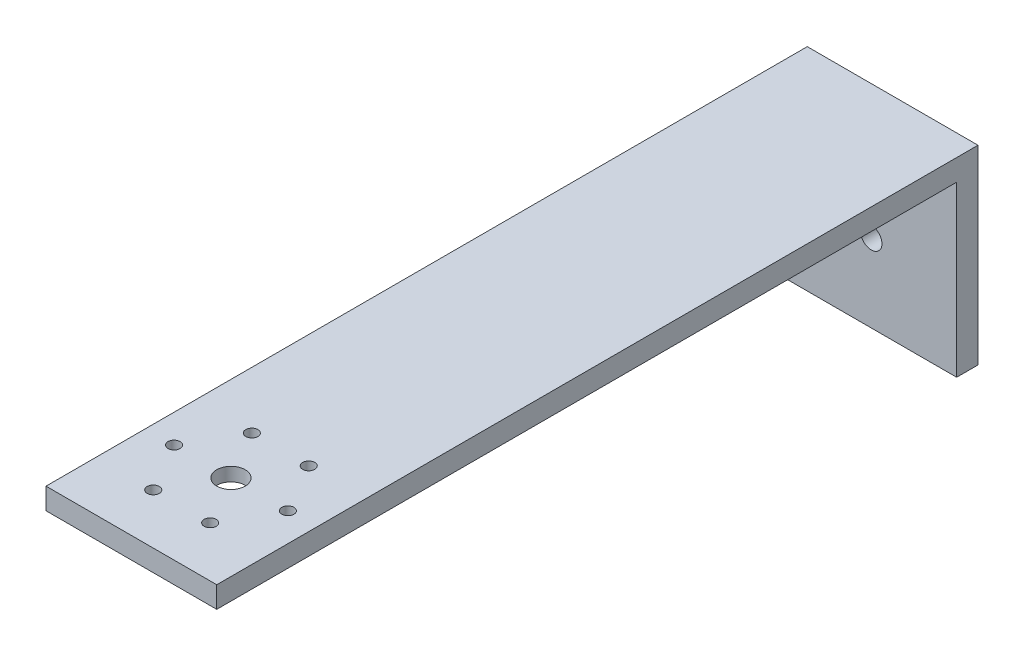
ISO-10303-21;
HEADER;
FILE_DESCRIPTION(('STEP AP214'),'2;1');
FILE_NAME('part.step','',(''),(''),'','','');
FILE_SCHEMA(('AUTOMOTIVE_DESIGN { 1 0 10303 214 1 1 1 1 }'));
ENDSEC;
DATA;
#1=APPLICATION_CONTEXT('core data for automotive mechanical design processes');
#2=APPLICATION_PROTOCOL_DEFINITION('international standard','automotive_design',2000,#1);
#3=PRODUCT_CONTEXT('',#1,'mechanical');
#4=PRODUCT('Part','Part','',(#3));
#5=PRODUCT_RELATED_PRODUCT_CATEGORY('part','',(#4));
#6=PRODUCT_DEFINITION_FORMATION('','',#4);
#7=PRODUCT_DEFINITION_CONTEXT('part definition',#1,'design');
#8=PRODUCT_DEFINITION('design','',#6,#7);
#9=PRODUCT_DEFINITION_SHAPE('','',#8);
#10=(LENGTH_UNIT() NAMED_UNIT(*) SI_UNIT(.MILLI.,.METRE.));
#11=(NAMED_UNIT(*) PLANE_ANGLE_UNIT() SI_UNIT($,.RADIAN.));
#12=(NAMED_UNIT(*) SI_UNIT($,.STERADIAN.) SOLID_ANGLE_UNIT());
#13=UNCERTAINTY_MEASURE_WITH_UNIT(LENGTH_MEASURE(1.E-05),#10,'distance_accuracy_value','');
#14=(GEOMETRIC_REPRESENTATION_CONTEXT(3) GLOBAL_UNCERTAINTY_ASSIGNED_CONTEXT((#13)) GLOBAL_UNIT_ASSIGNED_CONTEXT((#10,
#11,#12)) REPRESENTATION_CONTEXT('',''));
#15=CARTESIAN_POINT('',(0.,0.,0.));
#16=DIRECTION('',(0.,0.,1.));
#17=DIRECTION('',(1.,0.,0.));
#18=AXIS2_PLACEMENT_3D('',#15,#16,#17);
#19=CARTESIAN_POINT('',(0.,31.5,0.));
#20=DIRECTION('',(0.,1.,0.));
#21=DIRECTION('',(0.,0.,1.));
#22=AXIS2_PLACEMENT_3D('',#19,#20,#21);
#23=PLANE('',#22);
#24=CARTESIAN_POINT('',(8.,31.5,13.856406460551));
#25=DIRECTION('',(0.,1.,0.));
#26=DIRECTION('',(0.,0.,1.));
#27=AXIS2_PLACEMENT_3D('',#24,#25,#26);
#28=CIRCLE('',#27,1.7);
#29=CARTESIAN_POINT('',(8.,31.5,15.556406460551));
#30=VERTEX_POINT('',#29);
#31=EDGE_CURVE('E132',#30,#30,#28,.T.);
#32=ORIENTED_EDGE('',*,*,#31,.F.);
#33=EDGE_LOOP('',(#32));
#34=FACE_BOUND('',#33,.T.);
#35=CARTESIAN_POINT('',(-16.,31.5,0.));
#36=DIRECTION('',(0.,1.,0.));
#37=DIRECTION('',(0.,0.,1.));
#38=AXIS2_PLACEMENT_3D('',#35,#36,#37);
#39=CIRCLE('',#38,1.7);
#40=CARTESIAN_POINT('',(-16.,31.5,1.7));
#41=VERTEX_POINT('',#40);
#42=EDGE_CURVE('E150',#41,#41,#39,.T.);
#43=ORIENTED_EDGE('',*,*,#42,.F.);
#44=EDGE_LOOP('',(#43));
#45=FACE_BOUND('',#44,.T.);
#46=CARTESIAN_POINT('',(8.,31.5,-13.856406460551));
#47=DIRECTION('',(0.,1.,0.));
#48=DIRECTION('',(0.,0.,1.));
#49=AXIS2_PLACEMENT_3D('',#46,#47,#48);
#50=CIRCLE('',#49,1.7);
#51=CARTESIAN_POINT('',(8.,31.5,-12.156406460551));
#52=VERTEX_POINT('',#51);
#53=EDGE_CURVE('E157',#52,#52,#50,.T.);
#54=ORIENTED_EDGE('',*,*,#53,.F.);
#55=EDGE_LOOP('',(#54));
#56=FACE_BOUND('',#55,.T.);
#57=DIRECTION('',(0.,0.,1.));
#58=VECTOR('',#57,1.);
#59=CARTESIAN_POINT('',(-24.,31.5,-180.));
#60=LINE('',#59,#58);
#61=CARTESIAN_POINT('',(-24.,31.5,-186.));
#62=VERTEX_POINT('',#61);
#63=CARTESIAN_POINT('',(-24.,31.5,28.));
#64=VERTEX_POINT('',#63);
#65=EDGE_CURVE('E94',#62,#64,#60,.T.);
#66=ORIENTED_EDGE('',*,*,#65,.T.);
#67=DIRECTION('',(1.,0.,0.));
#68=VECTOR('',#67,1.);
#69=CARTESIAN_POINT('',(-24.,31.5,28.));
#70=LINE('',#69,#68);
#71=CARTESIAN_POINT('',(24.,31.5,28.));
#72=VERTEX_POINT('',#71);
#73=EDGE_CURVE('E60',#64,#72,#70,.T.);
#74=ORIENTED_EDGE('',*,*,#73,.T.);
#75=DIRECTION('',(0.,0.,-1.));
#76=VECTOR('',#75,1.);
#77=CARTESIAN_POINT('',(24.,31.5,28.));
#78=LINE('',#77,#76);
#79=CARTESIAN_POINT('',(24.,31.5,-186.));
#80=VERTEX_POINT('',#79);
#81=EDGE_CURVE('E171',#72,#80,#78,.T.);
#82=ORIENTED_EDGE('',*,*,#81,.T.);
#83=DIRECTION('',(-1.,0.,0.));
#84=VECTOR('',#83,1.);
#85=CARTESIAN_POINT('',(24.,31.5,-186.));
#86=LINE('',#85,#84);
#87=EDGE_CURVE('E117',#80,#62,#86,.T.);
#88=ORIENTED_EDGE('',*,*,#87,.T.);
#89=EDGE_LOOP('',(#66,#74,#82,#88));
#90=FACE_BOUND('',#89,.T.);
#91=CARTESIAN_POINT('',(16.,31.5,0.));
#92=DIRECTION('',(0.,1.,0.));
#93=DIRECTION('',(0.,0.,1.));
#94=AXIS2_PLACEMENT_3D('',#91,#92,#93);
#95=CIRCLE('',#94,1.7);
#96=CARTESIAN_POINT('',(16.,31.5,1.7));
#97=VERTEX_POINT('',#96);
#98=EDGE_CURVE('E164',#97,#97,#95,.T.);
#99=ORIENTED_EDGE('',*,*,#98,.F.);
#100=EDGE_LOOP('',(#99));
#101=FACE_BOUND('',#100,.T.);
#102=CARTESIAN_POINT('',(-8.,31.5,-13.856406460551));
#103=DIRECTION('',(0.,1.,0.));
#104=DIRECTION('',(0.,0.,1.));
#105=AXIS2_PLACEMENT_3D('',#102,#103,#104);
#106=CIRCLE('',#105,1.7);
#107=CARTESIAN_POINT('',(-8.,31.5,-12.156406460551));
#108=VERTEX_POINT('',#107);
#109=EDGE_CURVE('E153',#108,#108,#106,.T.);
#110=ORIENTED_EDGE('',*,*,#109,.F.);
#111=EDGE_LOOP('',(#110));
#112=FACE_BOUND('',#111,.T.);
#113=CARTESIAN_POINT('',(-8.00000000000001,31.5,13.856406460551));
#114=DIRECTION('',(0.,1.,0.));
#115=DIRECTION('',(0.,0.,1.));
#116=AXIS2_PLACEMENT_3D('',#113,#114,#115);
#117=CIRCLE('',#116,1.7);
#118=CARTESIAN_POINT('',(-8.00000000000001,31.5,15.556406460551));
#119=VERTEX_POINT('',#118);
#120=EDGE_CURVE('E143',#119,#119,#117,.T.);
#121=ORIENTED_EDGE('',*,*,#120,.F.);
#122=EDGE_LOOP('',(#121));
#123=FACE_BOUND('',#122,.T.);
#124=CARTESIAN_POINT('',(0.,31.5,0.));
#125=DIRECTION('',(0.,1.,0.));
#126=DIRECTION('',(0.,0.,1.));
#127=AXIS2_PLACEMENT_3D('',#124,#125,#126);
#128=CIRCLE('',#127,4.);
#129=CARTESIAN_POINT('',(0.,31.5,4.));
#130=VERTEX_POINT('',#129);
#131=EDGE_CURVE('E134',#130,#130,#128,.T.);
#132=ORIENTED_EDGE('',*,*,#131,.F.);
#133=EDGE_LOOP('',(#132));
#134=FACE_BOUND('',#133,.T.);
#135=ADVANCED_FACE('F39',(#34,#45,#56,#90,#101,#112,#123,#134),#23,.T.);
#136=CARTESIAN_POINT('',(0.,25.5,0.));
#137=DIRECTION('',(0.,1.,0.));
#138=DIRECTION('',(0.,0.,1.));
#139=AXIS2_PLACEMENT_3D('',#136,#137,#138);
#140=PLANE('',#139);
#141=CARTESIAN_POINT('',(0.,25.5,0.));
#142=DIRECTION('',(0.,1.,0.));
#143=DIRECTION('',(0.,0.,1.));
#144=AXIS2_PLACEMENT_3D('',#141,#142,#143);
#145=CIRCLE('',#144,12.15);
#146=CARTESIAN_POINT('',(0.,25.5,12.15));
#147=VERTEX_POINT('',#146);
#148=EDGE_CURVE('E123',#147,#147,#145,.T.);
#149=ORIENTED_EDGE('',*,*,#148,.T.);
#150=EDGE_LOOP('',(#149));
#151=FACE_BOUND('',#150,.T.);
#152=DIRECTION('',(0.,0.,1.));
#153=VECTOR('',#152,1.);
#154=CARTESIAN_POINT('',(-24.,25.5,-180.));
#155=LINE('',#154,#153);
#156=CARTESIAN_POINT('',(-24.,25.5,-180.));
#157=VERTEX_POINT('',#156);
#158=CARTESIAN_POINT('',(-24.,25.5,28.));
#159=VERTEX_POINT('',#158);
#160=EDGE_CURVE('E89',#157,#159,#155,.T.);
#161=ORIENTED_EDGE('',*,*,#160,.F.);
#162=DIRECTION('',(-1.,0.,0.));
#163=VECTOR('',#162,1.);
#164=CARTESIAN_POINT('',(24.,25.5,-180.));
#165=LINE('',#164,#163);
#166=CARTESIAN_POINT('',(24.,25.5,-180.));
#167=VERTEX_POINT('',#166);
#168=EDGE_CURVE('E84',#167,#157,#165,.T.);
#169=ORIENTED_EDGE('',*,*,#168,.F.);
#170=DIRECTION('',(0.,0.,-1.));
#171=VECTOR('',#170,1.);
#172=CARTESIAN_POINT('',(24.,25.5,28.));
#173=LINE('',#172,#171);
#174=CARTESIAN_POINT('',(24.,25.5,28.));
#175=VERTEX_POINT('',#174);
#176=EDGE_CURVE('E74',#175,#167,#173,.T.);
#177=ORIENTED_EDGE('',*,*,#176,.F.);
#178=DIRECTION('',(1.,0.,0.));
#179=VECTOR('',#178,1.);
#180=CARTESIAN_POINT('',(-24.,25.5,28.));
#181=LINE('',#180,#179);
#182=EDGE_CURVE('E69',#159,#175,#181,.T.);
#183=ORIENTED_EDGE('',*,*,#182,.F.);
#184=EDGE_LOOP('',(#161,#169,#177,#183));
#185=FACE_BOUND('',#184,.T.);
#186=CARTESIAN_POINT('',(16.,25.5,0.));
#187=DIRECTION('',(0.,1.,0.));
#188=DIRECTION('',(0.,0.,1.));
#189=AXIS2_PLACEMENT_3D('',#186,#187,#188);
#190=CIRCLE('',#189,1.7);
#191=CARTESIAN_POINT('',(16.,25.5,1.7));
#192=VERTEX_POINT('',#191);
#193=EDGE_CURVE('E165',#192,#192,#190,.T.);
#194=ORIENTED_EDGE('',*,*,#193,.T.);
#195=EDGE_LOOP('',(#194));
#196=FACE_BOUND('',#195,.T.);
#197=CARTESIAN_POINT('',(8.,25.5,-13.856406460551));
#198=DIRECTION('',(0.,1.,0.));
#199=DIRECTION('',(0.,0.,1.));
#200=AXIS2_PLACEMENT_3D('',#197,#198,#199);
#201=CIRCLE('',#200,1.7);
#202=CARTESIAN_POINT('',(8.,25.5,-12.156406460551));
#203=VERTEX_POINT('',#202);
#204=EDGE_CURVE('E156',#203,#203,#201,.T.);
#205=ORIENTED_EDGE('',*,*,#204,.T.);
#206=EDGE_LOOP('',(#205));
#207=FACE_BOUND('',#206,.T.);
#208=CARTESIAN_POINT('',(-8.,25.5,-13.856406460551));
#209=DIRECTION('',(0.,1.,0.));
#210=DIRECTION('',(0.,0.,1.));
#211=AXIS2_PLACEMENT_3D('',#208,#209,#210);
#212=CIRCLE('',#211,1.7);
#213=CARTESIAN_POINT('',(-8.,25.5,-12.156406460551));
#214=VERTEX_POINT('',#213);
#215=EDGE_CURVE('E147',#214,#214,#212,.T.);
#216=ORIENTED_EDGE('',*,*,#215,.T.);
#217=EDGE_LOOP('',(#216));
#218=FACE_BOUND('',#217,.T.);
#219=CARTESIAN_POINT('',(-16.,25.5,0.));
#220=DIRECTION('',(0.,1.,0.));
#221=DIRECTION('',(0.,0.,1.));
#222=AXIS2_PLACEMENT_3D('',#219,#220,#221);
#223=CIRCLE('',#222,1.7);
#224=CARTESIAN_POINT('',(-16.,25.5,1.7));
#225=VERTEX_POINT('',#224);
#226=EDGE_CURVE('E145',#225,#225,#223,.T.);
#227=ORIENTED_EDGE('',*,*,#226,.T.);
#228=EDGE_LOOP('',(#227));
#229=FACE_BOUND('',#228,.T.);
#230=CARTESIAN_POINT('',(-8.00000000000001,25.5,13.856406460551));
#231=DIRECTION('',(0.,1.,0.));
#232=DIRECTION('',(0.,0.,1.));
#233=AXIS2_PLACEMENT_3D('',#230,#231,#232);
#234=CIRCLE('',#233,1.7);
#235=CARTESIAN_POINT('',(-8.00000000000001,25.5,15.556406460551));
#236=VERTEX_POINT('',#235);
#237=EDGE_CURVE('E139',#236,#236,#234,.T.);
#238=ORIENTED_EDGE('',*,*,#237,.T.);
#239=EDGE_LOOP('',(#238));
#240=FACE_BOUND('',#239,.T.);
#241=CARTESIAN_POINT('',(8.,25.5,13.856406460551));
#242=DIRECTION('',(0.,1.,0.));
#243=DIRECTION('',(0.,0.,1.));
#244=AXIS2_PLACEMENT_3D('',#241,#242,#243);
#245=CIRCLE('',#244,1.7);
#246=CARTESIAN_POINT('',(8.,25.5,15.556406460551));
#247=VERTEX_POINT('',#246);
#248=EDGE_CURVE('E133',#247,#247,#245,.T.);
#249=ORIENTED_EDGE('',*,*,#248,.T.);
#250=EDGE_LOOP('',(#249));
#251=FACE_BOUND('',#250,.T.);
#252=ADVANCED_FACE('F87',(#151,#185,#196,#207,#218,#229,#240,#251),#140,.F.);
#253=CARTESIAN_POINT('',(-24.,31.5,-180.));
#254=DIRECTION('',(1.,0.,0.));
#255=DIRECTION('',(0.,0.,-1.));
#256=AXIS2_PLACEMENT_3D('',#253,#254,#255);
#257=PLANE('',#256);
#258=ORIENTED_EDGE('',*,*,#160,.T.);
#259=DIRECTION('',(0.,-1.,0.));
#260=VECTOR('',#259,1.);
#261=CARTESIAN_POINT('',(-24.,31.5,28.));
#262=LINE('',#261,#260);
#263=EDGE_CURVE('E11',#64,#159,#262,.T.);
#264=ORIENTED_EDGE('',*,*,#263,.F.);
#265=ORIENTED_EDGE('',*,*,#65,.F.);
#266=DIRECTION('',(0.,-1.,0.));
#267=VECTOR('',#266,1.);
#268=CARTESIAN_POINT('',(-24.,31.5,-186.));
#269=LINE('',#268,#267);
#270=CARTESIAN_POINT('',(-24.,-22.,-186.));
#271=VERTEX_POINT('',#270);
#272=EDGE_CURVE('E109',#62,#271,#269,.T.);
#273=ORIENTED_EDGE('',*,*,#272,.T.);
#274=DIRECTION('',(0.,0.,-1.));
#275=VECTOR('',#274,1.);
#276=CARTESIAN_POINT('',(-24.,-22.,-180.));
#277=LINE('',#276,#275);
#278=CARTESIAN_POINT('',(-24.,-22.,-180.));
#279=VERTEX_POINT('',#278);
#280=EDGE_CURVE('E102',#279,#271,#277,.T.);
#281=ORIENTED_EDGE('',*,*,#280,.F.);
#282=DIRECTION('',(0.,-1.,0.));
#283=VECTOR('',#282,1.);
#284=CARTESIAN_POINT('',(-24.,31.5,-180.));
#285=LINE('',#284,#283);
#286=EDGE_CURVE('E106',#157,#279,#285,.T.);
#287=ORIENTED_EDGE('',*,*,#286,.F.);
#288=EDGE_LOOP('',(#258,#264,#265,#273,#281,#287));
#289=FACE_BOUND('',#288,.T.);
#290=ADVANCED_FACE('F41',(#289),#257,.F.);
#291=CARTESIAN_POINT('',(-24.,31.5,28.));
#292=DIRECTION('',(0.,0.,-1.));
#293=DIRECTION('',(-1.,0.,0.));
#294=AXIS2_PLACEMENT_3D('',#291,#292,#293);
#295=PLANE('',#294);
#296=ORIENTED_EDGE('',*,*,#182,.T.);
#297=DIRECTION('',(0.,-1.,0.));
#298=VECTOR('',#297,1.);
#299=CARTESIAN_POINT('',(24.,31.5,28.));
#300=LINE('',#299,#298);
#301=EDGE_CURVE('E47',#72,#175,#300,.T.);
#302=ORIENTED_EDGE('',*,*,#301,.F.);
#303=ORIENTED_EDGE('',*,*,#73,.F.);
#304=ORIENTED_EDGE('',*,*,#263,.T.);
#305=EDGE_LOOP('',(#296,#302,#303,#304));
#306=FACE_BOUND('',#305,.T.);
#307=ADVANCED_FACE('F219',(#306),#295,.F.);
#308=CARTESIAN_POINT('',(24.,31.5,28.));
#309=DIRECTION('',(-1.,0.,0.));
#310=DIRECTION('',(0.,0.,1.));
#311=AXIS2_PLACEMENT_3D('',#308,#309,#310);
#312=PLANE('',#311);
#313=ORIENTED_EDGE('',*,*,#176,.T.);
#314=DIRECTION('',(0.,1.,0.));
#315=VECTOR('',#314,1.);
#316=CARTESIAN_POINT('',(24.,-22.,-180.));
#317=LINE('',#316,#315);
#318=CARTESIAN_POINT('',(24.,-22.,-180.));
#319=VERTEX_POINT('',#318);
#320=EDGE_CURVE('E77',#319,#167,#317,.T.);
#321=ORIENTED_EDGE('',*,*,#320,.F.);
#322=DIRECTION('',(0.,0.,-1.));
#323=VECTOR('',#322,1.);
#324=CARTESIAN_POINT('',(24.,-22.,-180.));
#325=LINE('',#324,#323);
#326=CARTESIAN_POINT('',(24.,-22.,-186.));
#327=VERTEX_POINT('',#326);
#328=EDGE_CURVE('E105',#319,#327,#325,.T.);
#329=ORIENTED_EDGE('',*,*,#328,.T.);
#330=DIRECTION('',(0.,1.,0.));
#331=VECTOR('',#330,1.);
#332=CARTESIAN_POINT('',(24.,-22.,-186.));
#333=LINE('',#332,#331);
#334=EDGE_CURVE('E116',#327,#80,#333,.T.);
#335=ORIENTED_EDGE('',*,*,#334,.T.);
#336=ORIENTED_EDGE('',*,*,#81,.F.);
#337=ORIENTED_EDGE('',*,*,#301,.T.);
#338=EDGE_LOOP('',(#313,#321,#329,#335,#336,#337));
#339=FACE_BOUND('',#338,.T.);
#340=ADVANCED_FACE('F79',(#339),#312,.F.);
#341=CARTESIAN_POINT('',(16.,31.5,0.));
#342=DIRECTION('',(0.,-1.,0.));
#343=DIRECTION('',(0.,0.,-1.));
#344=AXIS2_PLACEMENT_3D('',#341,#342,#343);
#345=CYLINDRICAL_SURFACE('',#344,1.7);
#346=ORIENTED_EDGE('',*,*,#98,.T.);
#347=EDGE_LOOP('',(#346));
#348=FACE_BOUND('',#347,.T.);
#349=ORIENTED_EDGE('',*,*,#193,.F.);
#350=EDGE_LOOP('',(#349));
#351=FACE_BOUND('',#350,.T.);
#352=ADVANCED_FACE('F220',(#348,#351),#345,.F.);
#353=CARTESIAN_POINT('',(8.,31.5,-13.856406460551));
#354=DIRECTION('',(0.,-1.,0.));
#355=DIRECTION('',(0.,0.,-1.));
#356=AXIS2_PLACEMENT_3D('',#353,#354,#355);
#357=CYLINDRICAL_SURFACE('',#356,1.7);
#358=ORIENTED_EDGE('',*,*,#53,.T.);
#359=EDGE_LOOP('',(#358));
#360=FACE_BOUND('',#359,.T.);
#361=ORIENTED_EDGE('',*,*,#204,.F.);
#362=EDGE_LOOP('',(#361));
#363=FACE_BOUND('',#362,.T.);
#364=ADVANCED_FACE('F292',(#360,#363),#357,.F.);
#365=CARTESIAN_POINT('',(-8.,31.5,-13.856406460551));
#366=DIRECTION('',(0.,-1.,0.));
#367=DIRECTION('',(0.,0.,-1.));
#368=AXIS2_PLACEMENT_3D('',#365,#366,#367);
#369=CYLINDRICAL_SURFACE('',#368,1.7);
#370=ORIENTED_EDGE('',*,*,#109,.T.);
#371=EDGE_LOOP('',(#370));
#372=FACE_BOUND('',#371,.T.);
#373=ORIENTED_EDGE('',*,*,#215,.F.);
#374=EDGE_LOOP('',(#373));
#375=FACE_BOUND('',#374,.T.);
#376=ADVANCED_FACE('F289',(#372,#375),#369,.F.);
#377=CARTESIAN_POINT('',(-16.,31.5,0.));
#378=DIRECTION('',(0.,-1.,0.));
#379=DIRECTION('',(0.,0.,-1.));
#380=AXIS2_PLACEMENT_3D('',#377,#378,#379);
#381=CYLINDRICAL_SURFACE('',#380,1.7);
#382=ORIENTED_EDGE('',*,*,#42,.T.);
#383=EDGE_LOOP('',(#382));
#384=FACE_BOUND('',#383,.T.);
#385=ORIENTED_EDGE('',*,*,#226,.F.);
#386=EDGE_LOOP('',(#385));
#387=FACE_BOUND('',#386,.T.);
#388=ADVANCED_FACE('F283',(#384,#387),#381,.F.);
#389=CARTESIAN_POINT('',(-8.00000000000001,31.5,13.856406460551));
#390=DIRECTION('',(0.,-1.,0.));
#391=DIRECTION('',(0.,0.,-1.));
#392=AXIS2_PLACEMENT_3D('',#389,#390,#391);
#393=CYLINDRICAL_SURFACE('',#392,1.7);
#394=ORIENTED_EDGE('',*,*,#120,.T.);
#395=EDGE_LOOP('',(#394));
#396=FACE_BOUND('',#395,.T.);
#397=ORIENTED_EDGE('',*,*,#237,.F.);
#398=EDGE_LOOP('',(#397));
#399=FACE_BOUND('',#398,.T.);
#400=ADVANCED_FACE('F278',(#396,#399),#393,.F.);
#401=CARTESIAN_POINT('',(8.,31.5,13.856406460551));
#402=DIRECTION('',(0.,-1.,0.));
#403=DIRECTION('',(0.,0.,-1.));
#404=AXIS2_PLACEMENT_3D('',#401,#402,#403);
#405=CYLINDRICAL_SURFACE('',#404,1.7);
#406=ORIENTED_EDGE('',*,*,#31,.T.);
#407=EDGE_LOOP('',(#406));
#408=FACE_BOUND('',#407,.T.);
#409=ORIENTED_EDGE('',*,*,#248,.F.);
#410=EDGE_LOOP('',(#409));
#411=FACE_BOUND('',#410,.T.);
#412=ADVANCED_FACE('F277',(#408,#411),#405,.F.);
#413=CARTESIAN_POINT('',(0.,31.5,0.));
#414=DIRECTION('',(0.,-1.,0.));
#415=DIRECTION('',(0.,0.,-1.));
#416=AXIS2_PLACEMENT_3D('',#413,#414,#415);
#417=CYLINDRICAL_SURFACE('',#416,4.);
#418=CARTESIAN_POINT('',(0.,27.7,0.));
#419=DIRECTION('',(0.,1.,0.));
#420=DIRECTION('',(0.,0.,1.));
#421=AXIS2_PLACEMENT_3D('',#418,#419,#420);
#422=CIRCLE('',#421,4.);
#423=CARTESIAN_POINT('',(0.,27.7,4.));
#424=VERTEX_POINT('',#423);
#425=EDGE_CURVE('E43',#424,#424,#422,.T.);
#426=ORIENTED_EDGE('',*,*,#425,.F.);
#427=EDGE_LOOP('',(#426));
#428=FACE_BOUND('',#427,.T.);
#429=ORIENTED_EDGE('',*,*,#131,.T.);
#430=EDGE_LOOP('',(#429));
#431=FACE_BOUND('',#430,.T.);
#432=ADVANCED_FACE('F275',(#428,#431),#417,.F.);
#433=CARTESIAN_POINT('',(0.,27.7,0.));
#434=DIRECTION('',(0.,-1.,0.));
#435=DIRECTION('',(0.,0.,-1.));
#436=AXIS2_PLACEMENT_3D('',#433,#434,#435);
#437=CYLINDRICAL_SURFACE('',#436,12.15);
#438=CARTESIAN_POINT('',(0.,27.7,0.));
#439=DIRECTION('',(0.,1.,0.));
#440=DIRECTION('',(0.,0.,1.));
#441=AXIS2_PLACEMENT_3D('',#438,#439,#440);
#442=CIRCLE('',#441,12.15);
#443=CARTESIAN_POINT('',(0.,27.7,12.15));
#444=VERTEX_POINT('',#443);
#445=EDGE_CURVE('E127',#444,#444,#442,.T.);
#446=ORIENTED_EDGE('',*,*,#445,.T.);
#447=EDGE_LOOP('',(#446));
#448=FACE_BOUND('',#447,.T.);
#449=ORIENTED_EDGE('',*,*,#148,.F.);
#450=EDGE_LOOP('',(#449));
#451=FACE_BOUND('',#450,.T.);
#452=ADVANCED_FACE('F205',(#448,#451),#437,.F.);
#453=CARTESIAN_POINT('',(0.,27.7,0.));
#454=DIRECTION('',(0.,1.,0.));
#455=DIRECTION('',(0.,0.,1.));
#456=AXIS2_PLACEMENT_3D('',#453,#454,#455);
#457=PLANE('',#456);
#458=ORIENTED_EDGE('',*,*,#425,.T.);
#459=EDGE_LOOP('',(#458));
#460=FACE_BOUND('',#459,.T.);
#461=ORIENTED_EDGE('',*,*,#445,.F.);
#462=EDGE_LOOP('',(#461));
#463=FACE_BOUND('',#462,.T.);
#464=ADVANCED_FACE('F195',(#460,#463),#457,.F.);
#465=CARTESIAN_POINT('',(0.,0.,-180.));
#466=DIRECTION('',(0.,0.,1.));
#467=DIRECTION('',(1.,0.,0.));
#468=AXIS2_PLACEMENT_3D('',#465,#466,#467);
#469=PLANE('',#468);
#470=ORIENTED_EDGE('',*,*,#320,.T.);
#471=ORIENTED_EDGE('',*,*,#168,.T.);
#472=ORIENTED_EDGE('',*,*,#286,.T.);
#473=DIRECTION('',(1.,0.,0.));
#474=VECTOR('',#473,1.);
#475=CARTESIAN_POINT('',(-24.,-22.,-180.));
#476=LINE('',#475,#474);
#477=EDGE_CURVE('E99',#279,#319,#476,.T.);
#478=ORIENTED_EDGE('',*,*,#477,.T.);
#479=EDGE_LOOP('',(#470,#471,#472,#478));
#480=FACE_BOUND('',#479,.T.);
#481=CARTESIAN_POINT('',(0.,0.,-180.));
#482=DIRECTION('',(0.,0.,1.));
#483=DIRECTION('',(1.,0.,0.));
#484=AXIS2_PLACEMENT_3D('',#481,#482,#483);
#485=CIRCLE('',#484,3.);
#486=CARTESIAN_POINT('',(3.,0.,-180.));
#487=VERTEX_POINT('',#486);
#488=EDGE_CURVE('E111',#487,#487,#485,.T.);
#489=ORIENTED_EDGE('',*,*,#488,.F.);
#490=EDGE_LOOP('',(#489));
#491=FACE_BOUND('',#490,.T.);
#492=ADVANCED_FACE('F100',(#480,#491),#469,.T.);
#493=CARTESIAN_POINT('',(0.,0.,-186.));
#494=DIRECTION('',(0.,0.,1.));
#495=DIRECTION('',(1.,0.,0.));
#496=AXIS2_PLACEMENT_3D('',#493,#494,#495);
#497=PLANE('',#496);
#498=ORIENTED_EDGE('',*,*,#272,.F.);
#499=ORIENTED_EDGE('',*,*,#87,.F.);
#500=ORIENTED_EDGE('',*,*,#334,.F.);
#501=DIRECTION('',(1.,0.,0.));
#502=VECTOR('',#501,1.);
#503=CARTESIAN_POINT('',(-24.,-22.,-186.));
#504=LINE('',#503,#502);
#505=EDGE_CURVE('E114',#271,#327,#504,.T.);
#506=ORIENTED_EDGE('',*,*,#505,.F.);
#507=EDGE_LOOP('',(#498,#499,#500,#506));
#508=FACE_BOUND('',#507,.T.);
#509=CARTESIAN_POINT('',(0.,0.,-186.));
#510=DIRECTION('',(0.,0.,1.));
#511=DIRECTION('',(1.,0.,0.));
#512=AXIS2_PLACEMENT_3D('',#509,#510,#511);
#513=CIRCLE('',#512,3.);
#514=CARTESIAN_POINT('',(3.,0.,-186.));
#515=VERTEX_POINT('',#514);
#516=EDGE_CURVE('E185',#515,#515,#513,.T.);
#517=ORIENTED_EDGE('',*,*,#516,.T.);
#518=EDGE_LOOP('',(#517));
#519=FACE_BOUND('',#518,.T.);
#520=ADVANCED_FACE('F192',(#508,#519),#497,.F.);
#521=CARTESIAN_POINT('',(-24.,-22.,-180.));
#522=DIRECTION('',(0.,1.,0.));
#523=DIRECTION('',(0.,0.,1.));
#524=AXIS2_PLACEMENT_3D('',#521,#522,#523);
#525=PLANE('',#524);
#526=ORIENTED_EDGE('',*,*,#505,.T.);
#527=ORIENTED_EDGE('',*,*,#328,.F.);
#528=ORIENTED_EDGE('',*,*,#477,.F.);
#529=ORIENTED_EDGE('',*,*,#280,.T.);
#530=EDGE_LOOP('',(#526,#527,#528,#529));
#531=FACE_BOUND('',#530,.T.);
#532=ADVANCED_FACE('F196',(#531),#525,.F.);
#533=CARTESIAN_POINT('',(0.,0.,-180.));
#534=DIRECTION('',(0.,0.,-1.));
#535=DIRECTION('',(-1.,0.,0.));
#536=AXIS2_PLACEMENT_3D('',#533,#534,#535);
#537=CYLINDRICAL_SURFACE('',#536,3.);
#538=ORIENTED_EDGE('',*,*,#488,.T.);
#539=EDGE_LOOP('',(#538));
#540=FACE_BOUND('',#539,.T.);
#541=ORIENTED_EDGE('',*,*,#516,.F.);
#542=EDGE_LOOP('',(#541));
#543=FACE_BOUND('',#542,.T.);
#544=ADVANCED_FACE('F190',(#540,#543),#537,.F.);
#545=CLOSED_SHELL('',(#135,#252,#290,#307,#340,#352,#364,#376,#388,#400,#412,#432,#452,#464,
#492,#520,#532,#544));
#546=MANIFOLD_SOLID_BREP('B2',#545);
#547=ADVANCED_BREP_SHAPE_REPRESENTATION('',(#18,#546),#14);
#548=SHAPE_DEFINITION_REPRESENTATION(#9,#547);
ENDSEC;
END-ISO-10303-21;
